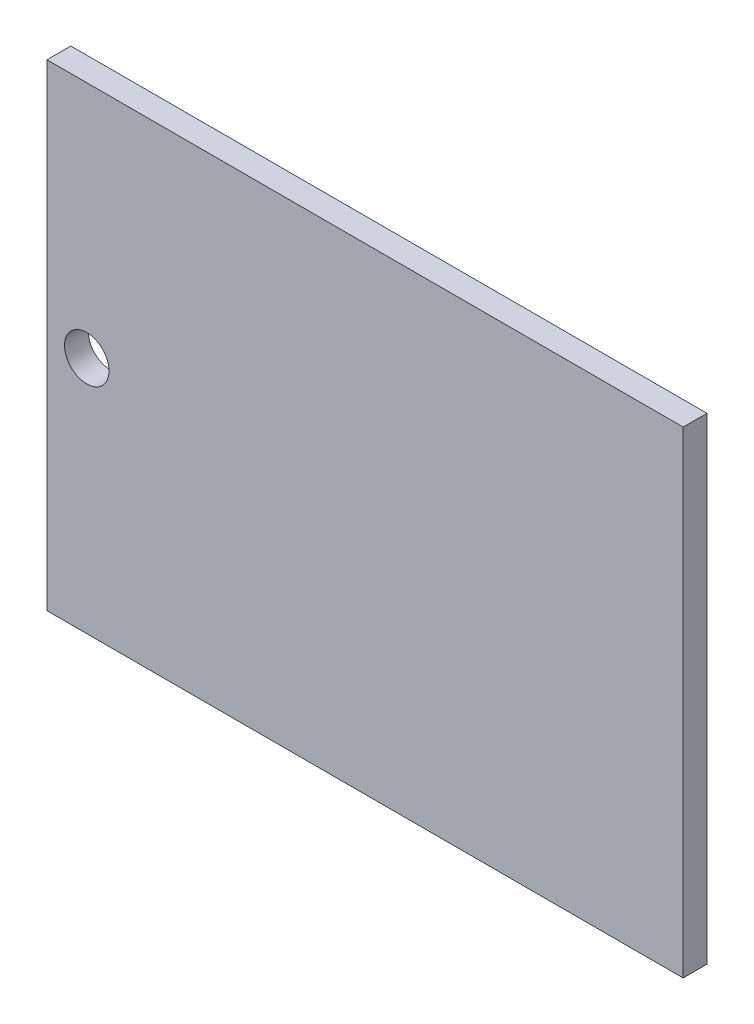
ISO-10303-21;
HEADER;
FILE_DESCRIPTION(('STEP AP214'),'2;1');
FILE_NAME('part.step','',(''),(''),'','','');
FILE_SCHEMA(('AUTOMOTIVE_DESIGN { 1 0 10303 214 1 1 1 1 }'));
ENDSEC;
DATA;
#1=APPLICATION_CONTEXT('core data for automotive mechanical design processes');
#2=APPLICATION_PROTOCOL_DEFINITION('international standard','automotive_design',2000,#1);
#3=PRODUCT_CONTEXT('',#1,'mechanical');
#4=PRODUCT('Part','Part','',(#3));
#5=PRODUCT_RELATED_PRODUCT_CATEGORY('part','',(#4));
#6=PRODUCT_DEFINITION_FORMATION('','',#4);
#7=PRODUCT_DEFINITION_CONTEXT('part definition',#1,'design');
#8=PRODUCT_DEFINITION('design','',#6,#7);
#9=PRODUCT_DEFINITION_SHAPE('','',#8);
#10=(LENGTH_UNIT() NAMED_UNIT(*) SI_UNIT(.MILLI.,.METRE.));
#11=(NAMED_UNIT(*) PLANE_ANGLE_UNIT() SI_UNIT($,.RADIAN.));
#12=(NAMED_UNIT(*) SI_UNIT($,.STERADIAN.) SOLID_ANGLE_UNIT());
#13=UNCERTAINTY_MEASURE_WITH_UNIT(LENGTH_MEASURE(1.E-05),#10,'distance_accuracy_value','');
#14=(GEOMETRIC_REPRESENTATION_CONTEXT(3) GLOBAL_UNCERTAINTY_ASSIGNED_CONTEXT((#13)) GLOBAL_UNIT_ASSIGNED_CONTEXT((#10,
#11,#12)) REPRESENTATION_CONTEXT('',''));
#15=CARTESIAN_POINT('',(0.,0.,0.));
#16=DIRECTION('',(0.,0.,1.));
#17=DIRECTION('',(1.,0.,0.));
#18=AXIS2_PLACEMENT_3D('',#15,#16,#17);
#19=CARTESIAN_POINT('',(20.,-15.,1.5));
#20=DIRECTION('',(-1.,0.,0.));
#21=DIRECTION('',(0.,0.,1.));
#22=AXIS2_PLACEMENT_3D('',#19,#20,#21);
#23=PLANE('',#22);
#24=DIRECTION('',(0.,1.,0.));
#25=VECTOR('',#24,1.);
#26=CARTESIAN_POINT('',(20.,-15.,0.));
#27=LINE('',#26,#25);
#28=CARTESIAN_POINT('',(20.,-15.,0.));
#29=VERTEX_POINT('',#28);
#30=CARTESIAN_POINT('',(20.,15.,0.));
#31=VERTEX_POINT('',#30);
#32=EDGE_CURVE('E105',#29,#31,#27,.T.);
#33=ORIENTED_EDGE('',*,*,#32,.T.);
#34=DIRECTION('',(0.,0.,-1.));
#35=VECTOR('',#34,1.);
#36=CARTESIAN_POINT('',(20.,15.,1.5));
#37=LINE('',#36,#35);
#38=CARTESIAN_POINT('',(20.,15.,1.5));
#39=VERTEX_POINT('',#38);
#40=EDGE_CURVE('E11',#39,#31,#37,.T.);
#41=ORIENTED_EDGE('',*,*,#40,.F.);
#42=DIRECTION('',(0.,1.,0.));
#43=VECTOR('',#42,1.);
#44=CARTESIAN_POINT('',(20.,-15.,1.5));
#45=LINE('',#44,#43);
#46=CARTESIAN_POINT('',(20.,-15.,1.5));
#47=VERTEX_POINT('',#46);
#48=EDGE_CURVE('E89',#47,#39,#45,.T.);
#49=ORIENTED_EDGE('',*,*,#48,.F.);
#50=DIRECTION('',(0.,0.,-1.));
#51=VECTOR('',#50,1.);
#52=CARTESIAN_POINT('',(20.,-15.,1.5));
#53=LINE('',#52,#51);
#54=EDGE_CURVE('E98',#47,#29,#53,.T.);
#55=ORIENTED_EDGE('',*,*,#54,.T.);
#56=EDGE_LOOP('',(#33,#41,#49,#55));
#57=FACE_BOUND('',#56,.T.);
#58=ADVANCED_FACE('F39',(#57),#23,.F.);
#59=CARTESIAN_POINT('',(-20.,15.,1.5));
#60=DIRECTION('',(0.,-1.,0.));
#61=DIRECTION('',(0.,0.,-1.));
#62=AXIS2_PLACEMENT_3D('',#59,#60,#61);
#63=PLANE('',#62);
#64=DIRECTION('',(-1.,0.,0.));
#65=VECTOR('',#64,1.);
#66=CARTESIAN_POINT('',(-20.,15.,0.));
#67=LINE('',#66,#65);
#68=CARTESIAN_POINT('',(-20.,15.,0.));
#69=VERTEX_POINT('',#68);
#70=EDGE_CURVE('E94',#31,#69,#67,.T.);
#71=ORIENTED_EDGE('',*,*,#70,.T.);
#72=DIRECTION('',(0.,0.,-1.));
#73=VECTOR('',#72,1.);
#74=CARTESIAN_POINT('',(-20.,15.,1.5));
#75=LINE('',#74,#73);
#76=CARTESIAN_POINT('',(-20.,15.,1.5));
#77=VERTEX_POINT('',#76);
#78=EDGE_CURVE('E50',#77,#69,#75,.T.);
#79=ORIENTED_EDGE('',*,*,#78,.F.);
#80=DIRECTION('',(-1.,0.,0.));
#81=VECTOR('',#80,1.);
#82=CARTESIAN_POINT('',(-20.,15.,1.5));
#83=LINE('',#82,#81);
#84=EDGE_CURVE('E84',#39,#77,#83,.T.);
#85=ORIENTED_EDGE('',*,*,#84,.F.);
#86=ORIENTED_EDGE('',*,*,#40,.T.);
#87=EDGE_LOOP('',(#71,#79,#85,#86));
#88=FACE_BOUND('',#87,.T.);
#89=ADVANCED_FACE('F91',(#88),#63,.F.);
#90=CARTESIAN_POINT('',(-20.,-15.,1.5));
#91=DIRECTION('',(1.,0.,0.));
#92=DIRECTION('',(0.,0.,-1.));
#93=AXIS2_PLACEMENT_3D('',#90,#91,#92);
#94=PLANE('',#93);
#95=DIRECTION('',(0.,-1.,0.));
#96=VECTOR('',#95,1.);
#97=CARTESIAN_POINT('',(-20.,-15.,0.));
#98=LINE('',#97,#96);
#99=CARTESIAN_POINT('',(-20.,-15.,0.));
#100=VERTEX_POINT('',#99);
#101=EDGE_CURVE('E75',#69,#100,#98,.T.);
#102=ORIENTED_EDGE('',*,*,#101,.T.);
#103=DIRECTION('',(0.,0.,-1.));
#104=VECTOR('',#103,1.);
#105=CARTESIAN_POINT('',(-20.,-15.,1.5));
#106=LINE('',#105,#104);
#107=CARTESIAN_POINT('',(-20.,-15.,1.5));
#108=VERTEX_POINT('',#107);
#109=EDGE_CURVE('E92',#108,#100,#106,.T.);
#110=ORIENTED_EDGE('',*,*,#109,.F.);
#111=DIRECTION('',(0.,-1.,0.));
#112=VECTOR('',#111,1.);
#113=CARTESIAN_POINT('',(-20.,-15.,1.5));
#114=LINE('',#113,#112);
#115=EDGE_CURVE('E86',#77,#108,#114,.T.);
#116=ORIENTED_EDGE('',*,*,#115,.F.);
#117=ORIENTED_EDGE('',*,*,#78,.T.);
#118=EDGE_LOOP('',(#102,#110,#116,#117));
#119=FACE_BOUND('',#118,.T.);
#120=ADVANCED_FACE('F96',(#119),#94,.F.);
#121=CARTESIAN_POINT('',(-20.,-15.,1.5));
#122=DIRECTION('',(0.,1.,0.));
#123=DIRECTION('',(0.,0.,1.));
#124=AXIS2_PLACEMENT_3D('',#121,#122,#123);
#125=PLANE('',#124);
#126=DIRECTION('',(1.,0.,0.));
#127=VECTOR('',#126,1.);
#128=CARTESIAN_POINT('',(-20.,-15.,0.));
#129=LINE('',#128,#127);
#130=EDGE_CURVE('E80',#100,#29,#129,.T.);
#131=ORIENTED_EDGE('',*,*,#130,.T.);
#132=ORIENTED_EDGE('',*,*,#54,.F.);
#133=DIRECTION('',(1.,0.,0.));
#134=VECTOR('',#133,1.);
#135=CARTESIAN_POINT('',(-20.,-15.,1.5));
#136=LINE('',#135,#134);
#137=EDGE_CURVE('E54',#108,#47,#136,.T.);
#138=ORIENTED_EDGE('',*,*,#137,.F.);
#139=ORIENTED_EDGE('',*,*,#109,.T.);
#140=EDGE_LOOP('',(#131,#132,#138,#139));
#141=FACE_BOUND('',#140,.T.);
#142=ADVANCED_FACE('F109',(#141),#125,.F.);
#143=CARTESIAN_POINT('',(0.,0.,1.5));
#144=DIRECTION('',(0.,0.,-1.));
#145=DIRECTION('',(-1.,0.,0.));
#146=AXIS2_PLACEMENT_3D('',#143,#144,#145);
#147=PLANE('',#146);
#148=CARTESIAN_POINT('',(-17.5,0.,1.5));
#149=DIRECTION('',(0.,0.,1.));
#150=DIRECTION('',(1.,0.,0.));
#151=AXIS2_PLACEMENT_3D('',#148,#149,#150);
#152=CIRCLE('',#151,1.4);
#153=CARTESIAN_POINT('',(-16.1,0.,1.5));
#154=VERTEX_POINT('',#153);
#155=EDGE_CURVE('E119',#154,#154,#152,.T.);
#156=ORIENTED_EDGE('',*,*,#155,.F.);
#157=EDGE_LOOP('',(#156));
#158=FACE_BOUND('',#157,.T.);
#159=ORIENTED_EDGE('',*,*,#48,.T.);
#160=ORIENTED_EDGE('',*,*,#84,.T.);
#161=ORIENTED_EDGE('',*,*,#115,.T.);
#162=ORIENTED_EDGE('',*,*,#137,.T.);
#163=EDGE_LOOP('',(#159,#160,#161,#162));
#164=FACE_BOUND('',#163,.T.);
#165=ADVANCED_FACE('F88',(#158,#164),#147,.F.);
#166=CARTESIAN_POINT('',(0.,0.,0.));
#167=DIRECTION('',(0.,0.,-1.));
#168=DIRECTION('',(-1.,0.,0.));
#169=AXIS2_PLACEMENT_3D('',#166,#167,#168);
#170=PLANE('',#169);
#171=CARTESIAN_POINT('',(-17.5,0.,0.));
#172=DIRECTION('',(0.,0.,1.));
#173=DIRECTION('',(1.,0.,0.));
#174=AXIS2_PLACEMENT_3D('',#171,#172,#173);
#175=CIRCLE('',#174,1.4);
#176=CARTESIAN_POINT('',(-16.1,0.,0.));
#177=VERTEX_POINT('',#176);
#178=EDGE_CURVE('E104',#177,#177,#175,.T.);
#179=ORIENTED_EDGE('',*,*,#178,.T.);
#180=EDGE_LOOP('',(#179));
#181=FACE_BOUND('',#180,.T.);
#182=ORIENTED_EDGE('',*,*,#32,.F.);
#183=ORIENTED_EDGE('',*,*,#130,.F.);
#184=ORIENTED_EDGE('',*,*,#101,.F.);
#185=ORIENTED_EDGE('',*,*,#70,.F.);
#186=EDGE_LOOP('',(#182,#183,#184,#185));
#187=FACE_BOUND('',#186,.T.);
#188=ADVANCED_FACE('F114',(#181,#187),#170,.T.);
#189=CARTESIAN_POINT('',(-17.5,0.,0.));
#190=DIRECTION('',(0.,0.,1.));
#191=DIRECTION('',(1.,0.,0.));
#192=AXIS2_PLACEMENT_3D('',#189,#190,#191);
#193=CYLINDRICAL_SURFACE('',#192,1.4);
#194=ORIENTED_EDGE('',*,*,#178,.F.);
#195=EDGE_LOOP('',(#194));
#196=FACE_BOUND('',#195,.T.);
#197=ORIENTED_EDGE('',*,*,#155,.T.);
#198=EDGE_LOOP('',(#197));
#199=FACE_BOUND('',#198,.T.);
#200=ADVANCED_FACE('F123',(#196,#199),#193,.F.);
#201=CLOSED_SHELL('',(#58,#89,#120,#142,#165,#188,#200));
#202=MANIFOLD_SOLID_BREP('B2',#201);
#203=ADVANCED_BREP_SHAPE_REPRESENTATION('',(#18,#202),#14);
#204=SHAPE_DEFINITION_REPRESENTATION(#9,#203);
ENDSEC;
END-ISO-10303-21;
